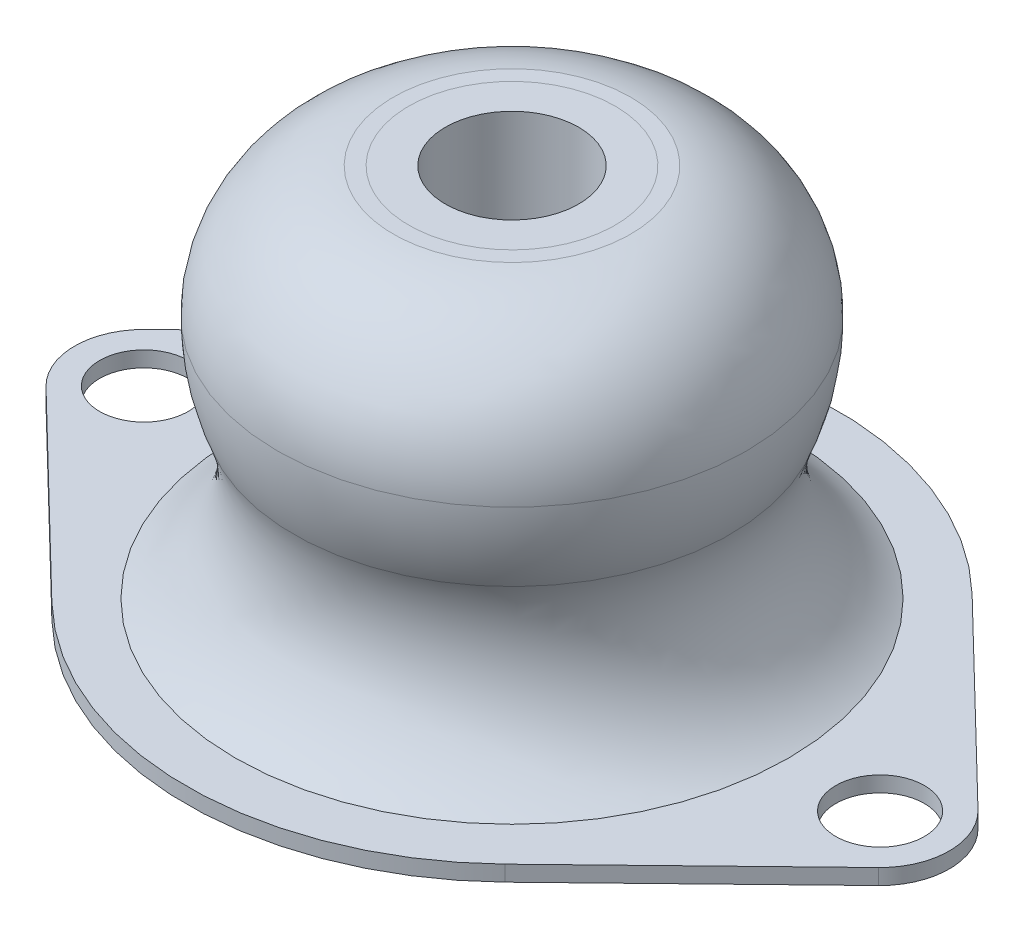
ISO-10303-21;
HEADER;
FILE_DESCRIPTION(('STEP AP214'),'2;1');
FILE_NAME('part.step','',(''),(''),'','','');
FILE_SCHEMA(('AUTOMOTIVE_DESIGN { 1 0 10303 214 1 1 1 1 }'));
ENDSEC;
DATA;
#1=APPLICATION_CONTEXT('core data for automotive mechanical design processes');
#2=APPLICATION_PROTOCOL_DEFINITION('international standard','automotive_design',2000,#1);
#3=PRODUCT_CONTEXT('',#1,'mechanical');
#4=PRODUCT('Part','Part','',(#3));
#5=PRODUCT_RELATED_PRODUCT_CATEGORY('part','',(#4));
#6=PRODUCT_DEFINITION_FORMATION('','',#4);
#7=PRODUCT_DEFINITION_CONTEXT('part definition',#1,'design');
#8=PRODUCT_DEFINITION('design','',#6,#7);
#9=PRODUCT_DEFINITION_SHAPE('','',#8);
#10=(LENGTH_UNIT() NAMED_UNIT(*) SI_UNIT(.MILLI.,.METRE.));
#11=(NAMED_UNIT(*) PLANE_ANGLE_UNIT() SI_UNIT($,.RADIAN.));
#12=(NAMED_UNIT(*) SI_UNIT($,.STERADIAN.) SOLID_ANGLE_UNIT());
#13=UNCERTAINTY_MEASURE_WITH_UNIT(LENGTH_MEASURE(1.E-05),#10,'distance_accuracy_value','');
#14=(GEOMETRIC_REPRESENTATION_CONTEXT(3) GLOBAL_UNCERTAINTY_ASSIGNED_CONTEXT((#13)) GLOBAL_UNIT_ASSIGNED_CONTEXT((#10,
#11,#12)) REPRESENTATION_CONTEXT('',''));
#15=CARTESIAN_POINT('',(0.,0.,0.));
#16=DIRECTION('',(0.,0.,1.));
#17=DIRECTION('',(1.,0.,0.));
#18=AXIS2_PLACEMENT_3D('',#15,#16,#17);
#19=CARTESIAN_POINT('',(-17.9578,-8.763,0.));
#20=DIRECTION('',(0.,-1.,0.));
#21=DIRECTION('',(0.,0.,-1.));
#22=AXIS2_PLACEMENT_3D('',#19,#20,#21);
#23=CYLINDRICAL_SURFACE('',#22,3.3782);
#24=CARTESIAN_POINT('',(-17.9578,-9.525,0.));
#25=DIRECTION('',(0.,-1.,0.));
#26=DIRECTION('',(0.,0.,-1.));
#27=AXIS2_PLACEMENT_3D('',#24,#25,#26);
#28=CIRCLE('',#27,3.3782);
#29=CARTESIAN_POINT('',(-20.3086831683168,-9.525,2.42602216991614));
#30=VERTEX_POINT('',#29);
#31=CARTESIAN_POINT('',(-20.3086831683168,-9.525,-2.42602216991614));
#32=VERTEX_POINT('',#31);
#33=EDGE_CURVE('E149',#30,#32,#28,.T.);
#34=ORIENTED_EDGE('',*,*,#33,.F.);
#35=DIRECTION('',(0.,-1.,0.));
#36=VECTOR('',#35,1.);
#37=CARTESIAN_POINT('',(-20.3086831683168,-8.763,2.42602216991614));
#38=LINE('',#37,#36);
#39=CARTESIAN_POINT('',(-20.3086831683168,-8.763,2.42602216991614));
#40=VERTEX_POINT('',#39);
#41=EDGE_CURVE('E12',#40,#30,#38,.T.);
#42=ORIENTED_EDGE('',*,*,#41,.F.);
#43=CARTESIAN_POINT('',(-17.9578,-8.763,0.));
#44=DIRECTION('',(0.,-1.,0.));
#45=DIRECTION('',(0.,0.,-1.));
#46=AXIS2_PLACEMENT_3D('',#43,#44,#45);
#47=CIRCLE('',#46,3.3782);
#48=CARTESIAN_POINT('',(-20.3086831683168,-8.763,-2.42602216991614));
#49=VERTEX_POINT('',#48);
#50=EDGE_CURVE('E170',#40,#49,#47,.T.);
#51=ORIENTED_EDGE('',*,*,#50,.T.);
#52=DIRECTION('',(0.,-1.,0.));
#53=VECTOR('',#52,1.);
#54=CARTESIAN_POINT('',(-20.3086831683168,-8.763,-2.42602216991614));
#55=LINE('',#54,#53);
#56=EDGE_CURVE('E55',#49,#32,#55,.T.);
#57=ORIENTED_EDGE('',*,*,#56,.T.);
#58=EDGE_LOOP('',(#34,#42,#51,#57));
#59=FACE_BOUND('',#58,.T.);
#60=ADVANCED_FACE('F52',(#59),#23,.T.);
#61=CARTESIAN_POINT('',(-20.3086831683168,-8.763,2.42602216991614));
#62=DIRECTION('',(-0.695898161244696,0.,0.718140480112527));
#63=DIRECTION('',(0.718140480112527,0.,0.695898161244696));
#64=AXIS2_PLACEMENT_3D('',#61,#62,#63);
#65=PLANE('',#64);
#66=DIRECTION('',(-0.718140480112527,0.,-0.695898161244696));
#67=VECTOR('',#66,1.);
#68=CARTESIAN_POINT('',(-20.3086831683168,-9.525,2.42602216991614));
#69=LINE('',#68,#67);
#70=CARTESIAN_POINT('',(-11.0473833097595,-9.525,11.4004801217864));
#71=VERTEX_POINT('',#70);
#72=EDGE_CURVE('E168',#71,#30,#69,.T.);
#73=ORIENTED_EDGE('',*,*,#72,.F.);
#74=DIRECTION('',(0.,-1.,0.));
#75=VECTOR('',#74,1.);
#76=CARTESIAN_POINT('',(-11.0473833097595,-8.763,11.4004801217864));
#77=LINE('',#76,#75);
#78=CARTESIAN_POINT('',(-11.0473833097595,-8.763,11.4004801217864));
#79=VERTEX_POINT('',#78);
#80=EDGE_CURVE('E61',#79,#71,#77,.T.);
#81=ORIENTED_EDGE('',*,*,#80,.F.);
#82=DIRECTION('',(-0.718140480112527,0.,-0.695898161244696));
#83=VECTOR('',#82,1.);
#84=CARTESIAN_POINT('',(-20.3086831683168,-8.763,2.42602216991614));
#85=LINE('',#84,#83);
#86=EDGE_CURVE('E139',#79,#40,#85,.T.);
#87=ORIENTED_EDGE('',*,*,#86,.T.);
#88=ORIENTED_EDGE('',*,*,#41,.T.);
#89=EDGE_LOOP('',(#73,#81,#87,#88));
#90=FACE_BOUND('',#89,.T.);
#91=ADVANCED_FACE('F182',(#90),#65,.T.);
#92=CARTESIAN_POINT('',(0.,-8.763,0.));
#93=DIRECTION('',(0.,-1.,0.));
#94=DIRECTION('',(0.,0.,-1.));
#95=AXIS2_PLACEMENT_3D('',#92,#93,#94);
#96=CYLINDRICAL_SURFACE('',#95,15.875);
#97=CARTESIAN_POINT('',(0.,-9.525,0.));
#98=DIRECTION('',(0.,-1.,0.));
#99=DIRECTION('',(0.,0.,-1.));
#100=AXIS2_PLACEMENT_3D('',#97,#98,#99);
#101=CIRCLE('',#100,15.875);
#102=CARTESIAN_POINT('',(11.0473833097596,-9.525,11.4004801217864));
#103=VERTEX_POINT('',#102);
#104=EDGE_CURVE('E126',#103,#71,#101,.T.);
#105=ORIENTED_EDGE('',*,*,#104,.F.);
#106=DIRECTION('',(0.,-1.,0.));
#107=VECTOR('',#106,1.);
#108=CARTESIAN_POINT('',(11.0473833097596,-8.763,11.4004801217864));
#109=LINE('',#108,#107);
#110=CARTESIAN_POINT('',(11.0473833097596,-8.763,11.4004801217864));
#111=VERTEX_POINT('',#110);
#112=EDGE_CURVE('E121',#111,#103,#109,.T.);
#113=ORIENTED_EDGE('',*,*,#112,.F.);
#114=CARTESIAN_POINT('',(0.,-8.763,0.));
#115=DIRECTION('',(0.,-1.,0.));
#116=DIRECTION('',(0.,0.,-1.));
#117=AXIS2_PLACEMENT_3D('',#114,#115,#116);
#118=CIRCLE('',#117,15.875);
#119=EDGE_CURVE('E124',#111,#79,#118,.T.);
#120=ORIENTED_EDGE('',*,*,#119,.T.);
#121=ORIENTED_EDGE('',*,*,#80,.T.);
#122=EDGE_LOOP('',(#105,#113,#120,#121));
#123=FACE_BOUND('',#122,.T.);
#124=ADVANCED_FACE('F123',(#123),#96,.T.);
#125=CARTESIAN_POINT('',(20.3086831683168,-8.763,2.42602216991614));
#126=DIRECTION('',(0.695898161244696,0.,0.718140480112527));
#127=DIRECTION('',(0.718140480112527,0.,-0.695898161244696));
#128=AXIS2_PLACEMENT_3D('',#125,#126,#127);
#129=PLANE('',#128);
#130=DIRECTION('',(-0.718140480112527,0.,0.695898161244696));
#131=VECTOR('',#130,1.);
#132=CARTESIAN_POINT('',(20.3086831683168,-9.525,2.42602216991614));
#133=LINE('',#132,#131);
#134=CARTESIAN_POINT('',(20.3086831683168,-9.525,2.42602216991614));
#135=VERTEX_POINT('',#134);
#136=EDGE_CURVE('E165',#135,#103,#133,.T.);
#137=ORIENTED_EDGE('',*,*,#136,.F.);
#138=DIRECTION('',(0.,-1.,0.));
#139=VECTOR('',#138,1.);
#140=CARTESIAN_POINT('',(20.3086831683168,-8.763,2.42602216991614));
#141=LINE('',#140,#139);
#142=CARTESIAN_POINT('',(20.3086831683168,-8.763,2.42602216991614));
#143=VERTEX_POINT('',#142);
#144=EDGE_CURVE('E131',#143,#135,#141,.T.);
#145=ORIENTED_EDGE('',*,*,#144,.F.);
#146=DIRECTION('',(-0.718140480112527,0.,0.695898161244696));
#147=VECTOR('',#146,1.);
#148=CARTESIAN_POINT('',(20.3086831683168,-8.763,2.42602216991614));
#149=LINE('',#148,#147);
#150=EDGE_CURVE('E137',#143,#111,#149,.T.);
#151=ORIENTED_EDGE('',*,*,#150,.T.);
#152=ORIENTED_EDGE('',*,*,#112,.T.);
#153=EDGE_LOOP('',(#137,#145,#151,#152));
#154=FACE_BOUND('',#153,.T.);
#155=ADVANCED_FACE('F141',(#154),#129,.T.);
#156=CARTESIAN_POINT('',(17.9578,-8.763,0.));
#157=DIRECTION('',(0.,-1.,0.));
#158=DIRECTION('',(0.,0.,-1.));
#159=AXIS2_PLACEMENT_3D('',#156,#157,#158);
#160=CYLINDRICAL_SURFACE('',#159,3.3782);
#161=CARTESIAN_POINT('',(17.9578,-9.525,0.));
#162=DIRECTION('',(0.,-1.,0.));
#163=DIRECTION('',(0.,0.,-1.));
#164=AXIS2_PLACEMENT_3D('',#161,#162,#163);
#165=CIRCLE('',#164,3.3782);
#166=CARTESIAN_POINT('',(20.3086831683168,-9.525,-2.42602216991614));
#167=VERTEX_POINT('',#166);
#168=EDGE_CURVE('E162',#167,#135,#165,.T.);
#169=ORIENTED_EDGE('',*,*,#168,.F.);
#170=DIRECTION('',(0.,-1.,0.));
#171=VECTOR('',#170,1.);
#172=CARTESIAN_POINT('',(20.3086831683168,-8.763,-2.42602216991614));
#173=LINE('',#172,#171);
#174=CARTESIAN_POINT('',(20.3086831683168,-8.763,-2.42602216991614));
#175=VERTEX_POINT('',#174);
#176=EDGE_CURVE('E174',#175,#167,#173,.T.);
#177=ORIENTED_EDGE('',*,*,#176,.F.);
#178=CARTESIAN_POINT('',(17.9578,-8.763,0.));
#179=DIRECTION('',(0.,-1.,0.));
#180=DIRECTION('',(0.,0.,-1.));
#181=AXIS2_PLACEMENT_3D('',#178,#179,#180);
#182=CIRCLE('',#181,3.3782);
#183=EDGE_CURVE('E142',#175,#143,#182,.T.);
#184=ORIENTED_EDGE('',*,*,#183,.T.);
#185=ORIENTED_EDGE('',*,*,#144,.T.);
#186=EDGE_LOOP('',(#169,#177,#184,#185));
#187=FACE_BOUND('',#186,.T.);
#188=ADVANCED_FACE('F195',(#187),#160,.T.);
#189=CARTESIAN_POINT('',(20.3086831683168,-8.763,-2.42602216991614));
#190=DIRECTION('',(0.695898161244697,0.,-0.718140480112527));
#191=DIRECTION('',(-0.718140480112527,0.,-0.695898161244697));
#192=AXIS2_PLACEMENT_3D('',#189,#190,#191);
#193=PLANE('',#192);
#194=DIRECTION('',(0.718140480112527,0.,0.695898161244697));
#195=VECTOR('',#194,1.);
#196=CARTESIAN_POINT('',(20.3086831683168,-9.525,-2.42602216991614));
#197=LINE('',#196,#195);
#198=CARTESIAN_POINT('',(11.0473833097596,-9.525,-11.4004801217864));
#199=VERTEX_POINT('',#198);
#200=EDGE_CURVE('E159',#199,#167,#197,.T.);
#201=ORIENTED_EDGE('',*,*,#200,.F.);
#202=DIRECTION('',(0.,-1.,0.));
#203=VECTOR('',#202,1.);
#204=CARTESIAN_POINT('',(11.0473833097596,-8.763,-11.4004801217864));
#205=LINE('',#204,#203);
#206=CARTESIAN_POINT('',(11.0473833097596,-8.763,-11.4004801217864));
#207=VERTEX_POINT('',#206);
#208=EDGE_CURVE('E176',#207,#199,#205,.T.);
#209=ORIENTED_EDGE('',*,*,#208,.F.);
#210=DIRECTION('',(0.718140480112527,0.,0.695898161244697));
#211=VECTOR('',#210,1.);
#212=CARTESIAN_POINT('',(20.3086831683168,-8.763,-2.42602216991614));
#213=LINE('',#212,#211);
#214=EDGE_CURVE('E144',#207,#175,#213,.T.);
#215=ORIENTED_EDGE('',*,*,#214,.T.);
#216=ORIENTED_EDGE('',*,*,#176,.T.);
#217=EDGE_LOOP('',(#201,#209,#215,#216));
#218=FACE_BOUND('',#217,.T.);
#219=ADVANCED_FACE('F198',(#218),#193,.T.);
#220=CARTESIAN_POINT('',(0.,-8.763,0.));
#221=DIRECTION('',(0.,-1.,0.));
#222=DIRECTION('',(0.,0.,-1.));
#223=AXIS2_PLACEMENT_3D('',#220,#221,#222);
#224=CYLINDRICAL_SURFACE('',#223,15.875);
#225=CARTESIAN_POINT('',(0.,-9.525,0.));
#226=DIRECTION('',(0.,-1.,0.));
#227=DIRECTION('',(0.,0.,-1.));
#228=AXIS2_PLACEMENT_3D('',#225,#226,#227);
#229=CIRCLE('',#228,15.875);
#230=CARTESIAN_POINT('',(-11.0473833097595,-9.525,-11.4004801217864));
#231=VERTEX_POINT('',#230);
#232=EDGE_CURVE('E156',#231,#199,#229,.T.);
#233=ORIENTED_EDGE('',*,*,#232,.F.);
#234=DIRECTION('',(0.,-1.,0.));
#235=VECTOR('',#234,1.);
#236=CARTESIAN_POINT('',(-11.0473833097595,-8.763,-11.4004801217864));
#237=LINE('',#236,#235);
#238=CARTESIAN_POINT('',(-11.0473833097595,-8.763,-11.4004801217864));
#239=VERTEX_POINT('',#238);
#240=EDGE_CURVE('E177',#239,#231,#237,.T.);
#241=ORIENTED_EDGE('',*,*,#240,.F.);
#242=CARTESIAN_POINT('',(0.,-8.763,0.));
#243=DIRECTION('',(0.,-1.,0.));
#244=DIRECTION('',(0.,0.,-1.));
#245=AXIS2_PLACEMENT_3D('',#242,#243,#244);
#246=CIRCLE('',#245,15.875);
#247=EDGE_CURVE('E254',#239,#207,#246,.T.);
#248=ORIENTED_EDGE('',*,*,#247,.T.);
#249=ORIENTED_EDGE('',*,*,#208,.T.);
#250=EDGE_LOOP('',(#233,#241,#248,#249));
#251=FACE_BOUND('',#250,.T.);
#252=ADVANCED_FACE('F202',(#251),#224,.T.);
#253=CARTESIAN_POINT('',(-20.3086831683168,-8.763,-2.42602216991614));
#254=DIRECTION('',(-0.695898161244696,0.,-0.718140480112527));
#255=DIRECTION('',(-0.718140480112527,0.,0.695898161244696));
#256=AXIS2_PLACEMENT_3D('',#253,#254,#255);
#257=PLANE('',#256);
#258=DIRECTION('',(0.718140480112527,0.,-0.695898161244696));
#259=VECTOR('',#258,1.);
#260=CARTESIAN_POINT('',(-20.3086831683168,-9.525,-2.42602216991614));
#261=LINE('',#260,#259);
#262=EDGE_CURVE('E152',#32,#231,#261,.T.);
#263=ORIENTED_EDGE('',*,*,#262,.F.);
#264=ORIENTED_EDGE('',*,*,#56,.F.);
#265=DIRECTION('',(0.718140480112527,0.,-0.695898161244696));
#266=VECTOR('',#265,1.);
#267=CARTESIAN_POINT('',(-20.3086831683168,-8.763,-2.42602216991614));
#268=LINE('',#267,#266);
#269=EDGE_CURVE('E252',#49,#239,#268,.T.);
#270=ORIENTED_EDGE('',*,*,#269,.T.);
#271=ORIENTED_EDGE('',*,*,#240,.T.);
#272=EDGE_LOOP('',(#263,#264,#270,#271));
#273=FACE_BOUND('',#272,.T.);
#274=ADVANCED_FACE('F179',(#273),#257,.T.);
#275=CARTESIAN_POINT('',(-17.9578,-8.763,0.));
#276=DIRECTION('',(0.,-1.,0.));
#277=DIRECTION('',(0.,0.,-1.));
#278=AXIS2_PLACEMENT_3D('',#275,#276,#277);
#279=PLANE('',#278);
#280=CARTESIAN_POINT('',(0.,-8.763,0.));
#281=DIRECTION('',(0.,-1.,0.));
#282=DIRECTION('',(0.,0.,-1.));
#283=AXIS2_PLACEMENT_3D('',#280,#281,#282);
#284=CIRCLE('',#283,9.525);
#285=CARTESIAN_POINT('',(0.,-8.763,-9.525));
#286=VERTEX_POINT('',#285);
#287=EDGE_CURVE('E233',#286,#286,#284,.T.);
#288=ORIENTED_EDGE('',*,*,#287,.T.);
#289=EDGE_LOOP('',(#288));
#290=FACE_BOUND('',#289,.T.);
#291=CARTESIAN_POINT('',(17.9578,-8.763,0.));
#292=DIRECTION('',(0.,-1.,0.));
#293=DIRECTION('',(0.,0.,-1.));
#294=AXIS2_PLACEMENT_3D('',#291,#292,#293);
#295=CIRCLE('',#294,2.159);
#296=CARTESIAN_POINT('',(17.9578,-8.763,-2.159));
#297=VERTEX_POINT('',#296);
#298=EDGE_CURVE('E241',#297,#297,#295,.T.);
#299=ORIENTED_EDGE('',*,*,#298,.T.);
#300=EDGE_LOOP('',(#299));
#301=FACE_BOUND('',#300,.T.);
#302=CARTESIAN_POINT('',(-17.9578,-8.763,0.));
#303=DIRECTION('',(0.,-1.,0.));
#304=DIRECTION('',(0.,0.,-1.));
#305=AXIS2_PLACEMENT_3D('',#302,#303,#304);
#306=CIRCLE('',#305,2.159);
#307=CARTESIAN_POINT('',(-17.9578,-8.763,-2.159));
#308=VERTEX_POINT('',#307);
#309=EDGE_CURVE('E153',#308,#308,#306,.T.);
#310=ORIENTED_EDGE('',*,*,#309,.T.);
#311=EDGE_LOOP('',(#310));
#312=FACE_BOUND('',#311,.T.);
#313=ORIENTED_EDGE('',*,*,#50,.F.);
#314=ORIENTED_EDGE('',*,*,#86,.F.);
#315=ORIENTED_EDGE('',*,*,#119,.F.);
#316=ORIENTED_EDGE('',*,*,#150,.F.);
#317=ORIENTED_EDGE('',*,*,#183,.F.);
#318=ORIENTED_EDGE('',*,*,#214,.F.);
#319=ORIENTED_EDGE('',*,*,#247,.F.);
#320=ORIENTED_EDGE('',*,*,#269,.F.);
#321=EDGE_LOOP('',(#313,#314,#315,#316,#317,#318,#319,#320));
#322=FACE_BOUND('',#321,.T.);
#323=ADVANCED_FACE('F135',(#290,#301,#312,#322),#279,.F.);
#324=CARTESIAN_POINT('',(-17.9578,-9.525,0.));
#325=DIRECTION('',(0.,-1.,0.));
#326=DIRECTION('',(0.,0.,-1.));
#327=AXIS2_PLACEMENT_3D('',#324,#325,#326);
#328=PLANE('',#327);
#329=CARTESIAN_POINT('',(0.,-9.525,0.));
#330=DIRECTION('',(0.,-1.,0.));
#331=DIRECTION('',(0.,0.,-1.));
#332=AXIS2_PLACEMENT_3D('',#329,#330,#331);
#333=CIRCLE('',#332,9.525);
#334=CARTESIAN_POINT('',(0.,-9.525,-9.525));
#335=VERTEX_POINT('',#334);
#336=EDGE_CURVE('E236',#335,#335,#333,.T.);
#337=ORIENTED_EDGE('',*,*,#336,.F.);
#338=EDGE_LOOP('',(#337));
#339=FACE_BOUND('',#338,.T.);
#340=CARTESIAN_POINT('',(17.9578,-9.525,0.));
#341=DIRECTION('',(0.,-1.,0.));
#342=DIRECTION('',(0.,0.,-1.));
#343=AXIS2_PLACEMENT_3D('',#340,#341,#342);
#344=CIRCLE('',#343,2.159);
#345=CARTESIAN_POINT('',(17.9578,-9.525,-2.159));
#346=VERTEX_POINT('',#345);
#347=EDGE_CURVE('E238',#346,#346,#344,.T.);
#348=ORIENTED_EDGE('',*,*,#347,.F.);
#349=EDGE_LOOP('',(#348));
#350=FACE_BOUND('',#349,.T.);
#351=CARTESIAN_POINT('',(-17.9578,-9.525,0.));
#352=DIRECTION('',(0.,-1.,0.));
#353=DIRECTION('',(0.,0.,-1.));
#354=AXIS2_PLACEMENT_3D('',#351,#352,#353);
#355=CIRCLE('',#354,2.159);
#356=CARTESIAN_POINT('',(-17.9578,-9.525,-2.159));
#357=VERTEX_POINT('',#356);
#358=EDGE_CURVE('E244',#357,#357,#355,.T.);
#359=ORIENTED_EDGE('',*,*,#358,.F.);
#360=EDGE_LOOP('',(#359));
#361=FACE_BOUND('',#360,.T.);
#362=ORIENTED_EDGE('',*,*,#33,.T.);
#363=ORIENTED_EDGE('',*,*,#262,.T.);
#364=ORIENTED_EDGE('',*,*,#232,.T.);
#365=ORIENTED_EDGE('',*,*,#200,.T.);
#366=ORIENTED_EDGE('',*,*,#168,.T.);
#367=ORIENTED_EDGE('',*,*,#136,.T.);
#368=ORIENTED_EDGE('',*,*,#104,.T.);
#369=ORIENTED_EDGE('',*,*,#72,.T.);
#370=EDGE_LOOP('',(#362,#363,#364,#365,#366,#367,#368,#369));
#371=FACE_BOUND('',#370,.T.);
#372=ADVANCED_FACE('F181',(#339,#350,#361,#371),#328,.T.);
#373=CARTESIAN_POINT('',(-17.9578,-8.763,0.));
#374=DIRECTION('',(0.,-1.,0.));
#375=DIRECTION('',(0.,0.,-1.));
#376=AXIS2_PLACEMENT_3D('',#373,#374,#375);
#377=CYLINDRICAL_SURFACE('',#376,2.159);
#378=CARTESIAN_POINT('',(-17.9578,-8.763,-2.159));
#379=CARTESIAN_POINT('',(-17.9578,-8.7709375,-2.159));
#380=CARTESIAN_POINT('',(-17.9578,-8.778875,-2.159));
#381=CARTESIAN_POINT('',(-17.9578,-8.79475,-2.159));
#382=CARTESIAN_POINT('',(-17.9578,-8.8026875,-2.159));
#383=CARTESIAN_POINT('',(-17.9578,-8.8185625,-2.159));
#384=CARTESIAN_POINT('',(-17.9578,-8.8265,-2.159));
#385=CARTESIAN_POINT('',(-17.9578,-8.842375,-2.159));
#386=CARTESIAN_POINT('',(-17.9578,-8.8503125,-2.159));
#387=CARTESIAN_POINT('',(-17.9578,-8.8661875,-2.159));
#388=CARTESIAN_POINT('',(-17.9578,-8.874125,-2.159));
#389=CARTESIAN_POINT('',(-17.9578,-8.89,-2.159));
#390=CARTESIAN_POINT('',(-17.9578,-8.8979375,-2.159));
#391=CARTESIAN_POINT('',(-17.9578,-8.9138125,-2.159));
#392=CARTESIAN_POINT('',(-17.9578,-8.92175,-2.159));
#393=CARTESIAN_POINT('',(-17.9578,-8.937625,-2.159));
#394=CARTESIAN_POINT('',(-17.9578,-8.9455625,-2.159));
#395=CARTESIAN_POINT('',(-17.9578,-8.9614375,-2.159));
#396=CARTESIAN_POINT('',(-17.9578,-8.969375,-2.159));
#397=CARTESIAN_POINT('',(-17.9578,-8.98525,-2.159));
#398=CARTESIAN_POINT('',(-17.9578,-8.9931875,-2.159));
#399=CARTESIAN_POINT('',(-17.9578,-9.0090625,-2.159));
#400=CARTESIAN_POINT('',(-17.9578,-9.017,-2.159));
#401=CARTESIAN_POINT('',(-17.9578,-9.032875,-2.159));
#402=CARTESIAN_POINT('',(-17.9578,-9.0408125,-2.159));
#403=CARTESIAN_POINT('',(-17.9578,-9.0566875,-2.159));
#404=CARTESIAN_POINT('',(-17.9578,-9.064625,-2.159));
#405=CARTESIAN_POINT('',(-17.9578,-9.0805,-2.159));
#406=CARTESIAN_POINT('',(-17.9578,-9.0884375,-2.159));
#407=CARTESIAN_POINT('',(-17.9578,-9.1043125,-2.159));
#408=CARTESIAN_POINT('',(-17.9578,-9.11225,-2.159));
#409=CARTESIAN_POINT('',(-17.9578,-9.128125,-2.159));
#410=CARTESIAN_POINT('',(-17.9578,-9.1360625,-2.159));
#411=CARTESIAN_POINT('',(-17.9578,-9.1519375,-2.159));
#412=CARTESIAN_POINT('',(-17.9578,-9.159875,-2.159));
#413=CARTESIAN_POINT('',(-17.9578,-9.17575,-2.159));
#414=CARTESIAN_POINT('',(-17.9578,-9.1836875,-2.159));
#415=CARTESIAN_POINT('',(-17.9578,-9.1995625,-2.159));
#416=CARTESIAN_POINT('',(-17.9578,-9.2075,-2.159));
#417=CARTESIAN_POINT('',(-17.9578,-9.223375,-2.159));
#418=CARTESIAN_POINT('',(-17.9578,-9.2313125,-2.159));
#419=CARTESIAN_POINT('',(-17.9578,-9.2471875,-2.159));
#420=CARTESIAN_POINT('',(-17.9578,-9.255125,-2.159));
#421=CARTESIAN_POINT('',(-17.9578,-9.271,-2.159));
#422=CARTESIAN_POINT('',(-17.9578,-9.2789375,-2.159));
#423=CARTESIAN_POINT('',(-17.9578,-9.2948125,-2.159));
#424=CARTESIAN_POINT('',(-17.9578,-9.30275,-2.159));
#425=CARTESIAN_POINT('',(-17.9578,-9.318625,-2.159));
#426=CARTESIAN_POINT('',(-17.9578,-9.3265625,-2.159));
#427=CARTESIAN_POINT('',(-17.9578,-9.3424375,-2.159));
#428=CARTESIAN_POINT('',(-17.9578,-9.350375,-2.159));
#429=CARTESIAN_POINT('',(-17.9578,-9.36625,-2.159));
#430=CARTESIAN_POINT('',(-17.9578,-9.3741875,-2.159));
#431=CARTESIAN_POINT('',(-17.9578,-9.3900625,-2.159));
#432=CARTESIAN_POINT('',(-17.9578,-9.398,-2.159));
#433=CARTESIAN_POINT('',(-17.9578,-9.413875,-2.159));
#434=CARTESIAN_POINT('',(-17.9578,-9.4218125,-2.159));
#435=CARTESIAN_POINT('',(-17.9578,-9.4376875,-2.159));
#436=CARTESIAN_POINT('',(-17.9578,-9.445625,-2.159));
#437=CARTESIAN_POINT('',(-17.9578,-9.4615,-2.159));
#438=CARTESIAN_POINT('',(-17.9578,-9.4694375,-2.159));
#439=CARTESIAN_POINT('',(-17.9578,-9.4853125,-2.159));
#440=CARTESIAN_POINT('',(-17.9578,-9.49325,-2.159));
#441=CARTESIAN_POINT('',(-17.9578,-9.509125,-2.159));
#442=CARTESIAN_POINT('',(-17.9578,-9.5170625,-2.159));
#443=CARTESIAN_POINT('',(-17.9578,-9.525,-2.159));
#444=B_SPLINE_CURVE_WITH_KNOTS('',3,(#378,#379,#380,#381,#382,#383,#384,#385,#386,#387,#388,
#389,#390,#391,#392,#393,#394,#395,#396,#397,#398,#399,#400,#401,#402,#403,#404,#405,#406,#407,
#408,#409,#410,#411,#412,#413,#414,#415,#416,#417,#418,#419,#420,#421,#422,#423,#424,#425,#426,
#427,#428,#429,#430,#431,#432,#433,#434,#435,#436,#437,#438,#439,#440,#441,#442,#443),
.UNSPECIFIED.,.F.,.F.,(4,2,2,2,2,2,2,2,2,2,2,2,2,2,2,2,2,2,2,2,2,2,2,2,2,2,2,2,2,2,2,2,4),(0.,
0.0238125000000013,0.0476250000000008,0.0714375000000003,0.0952500000000016,0.119062500000001,
0.142875000000001,0.1666875,0.190500000000001,0.214312500000001,0.238125,0.261937500000002,
0.285750000000001,0.309562500000001,0.333375,0.357187500000002,0.381000000000001,
0.404812500000001,0.428625000000002,0.452437500000001,0.476250000000001,0.500062500000001,
0.523875000000002,0.547687500000001,0.571500000000001,0.595312500000002,0.619125000000002,
0.642937500000001,0.666750000000001,0.690562500000002,0.714375000000001,0.738187500000001,
0.762000000000002),.UNSPECIFIED.);
#445=EDGE_CURVE('BSEAM214',#308,#357,#444,.T.);
#446=ORIENTED_EDGE('',*,*,#309,.F.);
#447=ORIENTED_EDGE('',*,*,#358,.T.);
#448=ORIENTED_EDGE('',*,*,#445,.T.);
#449=ORIENTED_EDGE('',*,*,#445,.F.);
#450=EDGE_LOOP('',(#446,#448,#447,#449));
#451=FACE_BOUND('',#450,.T.);
#452=ADVANCED_FACE('F214',(#451),#377,.F.);
#453=CARTESIAN_POINT('',(17.9578,-8.763,0.));
#454=DIRECTION('',(0.,-1.,0.));
#455=DIRECTION('',(0.,0.,-1.));
#456=AXIS2_PLACEMENT_3D('',#453,#454,#455);
#457=CYLINDRICAL_SURFACE('',#456,2.159);
#458=CARTESIAN_POINT('',(17.9578,-8.763,-2.159));
#459=CARTESIAN_POINT('',(17.9578,-8.7709375,-2.159));
#460=CARTESIAN_POINT('',(17.9578,-8.778875,-2.159));
#461=CARTESIAN_POINT('',(17.9578,-8.79475,-2.159));
#462=CARTESIAN_POINT('',(17.9578,-8.8026875,-2.159));
#463=CARTESIAN_POINT('',(17.9578,-8.8185625,-2.159));
#464=CARTESIAN_POINT('',(17.9578,-8.8265,-2.159));
#465=CARTESIAN_POINT('',(17.9578,-8.842375,-2.159));
#466=CARTESIAN_POINT('',(17.9578,-8.8503125,-2.159));
#467=CARTESIAN_POINT('',(17.9578,-8.8661875,-2.159));
#468=CARTESIAN_POINT('',(17.9578,-8.874125,-2.159));
#469=CARTESIAN_POINT('',(17.9578,-8.89,-2.159));
#470=CARTESIAN_POINT('',(17.9578,-8.8979375,-2.159));
#471=CARTESIAN_POINT('',(17.9578,-8.9138125,-2.159));
#472=CARTESIAN_POINT('',(17.9578,-8.92175,-2.159));
#473=CARTESIAN_POINT('',(17.9578,-8.937625,-2.159));
#474=CARTESIAN_POINT('',(17.9578,-8.9455625,-2.159));
#475=CARTESIAN_POINT('',(17.9578,-8.9614375,-2.159));
#476=CARTESIAN_POINT('',(17.9578,-8.969375,-2.159));
#477=CARTESIAN_POINT('',(17.9578,-8.98525,-2.159));
#478=CARTESIAN_POINT('',(17.9578,-8.9931875,-2.159));
#479=CARTESIAN_POINT('',(17.9578,-9.0090625,-2.159));
#480=CARTESIAN_POINT('',(17.9578,-9.017,-2.159));
#481=CARTESIAN_POINT('',(17.9578,-9.032875,-2.159));
#482=CARTESIAN_POINT('',(17.9578,-9.0408125,-2.159));
#483=CARTESIAN_POINT('',(17.9578,-9.0566875,-2.159));
#484=CARTESIAN_POINT('',(17.9578,-9.064625,-2.159));
#485=CARTESIAN_POINT('',(17.9578,-9.0805,-2.159));
#486=CARTESIAN_POINT('',(17.9578,-9.0884375,-2.159));
#487=CARTESIAN_POINT('',(17.9578,-9.1043125,-2.159));
#488=CARTESIAN_POINT('',(17.9578,-9.11225,-2.159));
#489=CARTESIAN_POINT('',(17.9578,-9.128125,-2.159));
#490=CARTESIAN_POINT('',(17.9578,-9.1360625,-2.159));
#491=CARTESIAN_POINT('',(17.9578,-9.1519375,-2.159));
#492=CARTESIAN_POINT('',(17.9578,-9.159875,-2.159));
#493=CARTESIAN_POINT('',(17.9578,-9.17575,-2.159));
#494=CARTESIAN_POINT('',(17.9578,-9.1836875,-2.159));
#495=CARTESIAN_POINT('',(17.9578,-9.1995625,-2.159));
#496=CARTESIAN_POINT('',(17.9578,-9.2075,-2.159));
#497=CARTESIAN_POINT('',(17.9578,-9.223375,-2.159));
#498=CARTESIAN_POINT('',(17.9578,-9.2313125,-2.159));
#499=CARTESIAN_POINT('',(17.9578,-9.2471875,-2.159));
#500=CARTESIAN_POINT('',(17.9578,-9.255125,-2.159));
#501=CARTESIAN_POINT('',(17.9578,-9.271,-2.159));
#502=CARTESIAN_POINT('',(17.9578,-9.2789375,-2.159));
#503=CARTESIAN_POINT('',(17.9578,-9.2948125,-2.159));
#504=CARTESIAN_POINT('',(17.9578,-9.30275,-2.159));
#505=CARTESIAN_POINT('',(17.9578,-9.318625,-2.159));
#506=CARTESIAN_POINT('',(17.9578,-9.3265625,-2.159));
#507=CARTESIAN_POINT('',(17.9578,-9.3424375,-2.159));
#508=CARTESIAN_POINT('',(17.9578,-9.350375,-2.159));
#509=CARTESIAN_POINT('',(17.9578,-9.36625,-2.159));
#510=CARTESIAN_POINT('',(17.9578,-9.3741875,-2.159));
#511=CARTESIAN_POINT('',(17.9578,-9.3900625,-2.159));
#512=CARTESIAN_POINT('',(17.9578,-9.398,-2.159));
#513=CARTESIAN_POINT('',(17.9578,-9.413875,-2.159));
#514=CARTESIAN_POINT('',(17.9578,-9.4218125,-2.159));
#515=CARTESIAN_POINT('',(17.9578,-9.4376875,-2.159));
#516=CARTESIAN_POINT('',(17.9578,-9.445625,-2.159));
#517=CARTESIAN_POINT('',(17.9578,-9.4615,-2.159));
#518=CARTESIAN_POINT('',(17.9578,-9.4694375,-2.159));
#519=CARTESIAN_POINT('',(17.9578,-9.4853125,-2.159));
#520=CARTESIAN_POINT('',(17.9578,-9.49325,-2.159));
#521=CARTESIAN_POINT('',(17.9578,-9.509125,-2.159));
#522=CARTESIAN_POINT('',(17.9578,-9.5170625,-2.159));
#523=CARTESIAN_POINT('',(17.9578,-9.525,-2.159));
#524=B_SPLINE_CURVE_WITH_KNOTS('',3,(#458,#459,#460,#461,#462,#463,#464,#465,#466,#467,#468,
#469,#470,#471,#472,#473,#474,#475,#476,#477,#478,#479,#480,#481,#482,#483,#484,#485,#486,#487,
#488,#489,#490,#491,#492,#493,#494,#495,#496,#497,#498,#499,#500,#501,#502,#503,#504,#505,#506,
#507,#508,#509,#510,#511,#512,#513,#514,#515,#516,#517,#518,#519,#520,#521,#522,#523),
.UNSPECIFIED.,.F.,.F.,(4,2,2,2,2,2,2,2,2,2,2,2,2,2,2,2,2,2,2,2,2,2,2,2,2,2,2,2,2,2,2,2,4),(0.,
0.0238125000000013,0.0476250000000008,0.0714375000000003,0.0952500000000016,0.119062500000001,
0.142875000000001,0.1666875,0.190500000000001,0.214312500000001,0.238125,0.261937500000002,
0.285750000000001,0.309562500000001,0.333375,0.357187500000002,0.381000000000001,
0.404812500000001,0.428625000000002,0.452437500000001,0.476250000000001,0.500062500000001,
0.523875000000002,0.547687500000001,0.571500000000001,0.595312500000002,0.619125000000002,
0.642937500000001,0.666750000000001,0.690562500000002,0.714375000000001,0.738187500000001,
0.762000000000002),.UNSPECIFIED.);
#525=EDGE_CURVE('BSEAM221',#297,#346,#524,.T.);
#526=ORIENTED_EDGE('',*,*,#298,.F.);
#527=ORIENTED_EDGE('',*,*,#347,.T.);
#528=ORIENTED_EDGE('',*,*,#525,.T.);
#529=ORIENTED_EDGE('',*,*,#525,.F.);
#530=EDGE_LOOP('',(#526,#528,#527,#529));
#531=FACE_BOUND('',#530,.T.);
#532=ADVANCED_FACE('F221',(#531),#457,.F.);
#533=CARTESIAN_POINT('',(0.,-8.763,0.));
#534=DIRECTION('',(0.,-1.,0.));
#535=DIRECTION('',(0.,0.,-1.));
#536=AXIS2_PLACEMENT_3D('',#533,#534,#535);
#537=CYLINDRICAL_SURFACE('',#536,9.525);
#538=CARTESIAN_POINT('',(0.,-8.763,-9.525));
#539=CARTESIAN_POINT('',(0.,-8.7709375,-9.525));
#540=CARTESIAN_POINT('',(0.,-8.778875,-9.525));
#541=CARTESIAN_POINT('',(0.,-8.79475,-9.525));
#542=CARTESIAN_POINT('',(0.,-8.8026875,-9.525));
#543=CARTESIAN_POINT('',(0.,-8.8185625,-9.525));
#544=CARTESIAN_POINT('',(0.,-8.8265,-9.525));
#545=CARTESIAN_POINT('',(0.,-8.842375,-9.525));
#546=CARTESIAN_POINT('',(0.,-8.8503125,-9.525));
#547=CARTESIAN_POINT('',(0.,-8.8661875,-9.525));
#548=CARTESIAN_POINT('',(0.,-8.874125,-9.525));
#549=CARTESIAN_POINT('',(0.,-8.89,-9.525));
#550=CARTESIAN_POINT('',(0.,-8.8979375,-9.525));
#551=CARTESIAN_POINT('',(0.,-8.9138125,-9.525));
#552=CARTESIAN_POINT('',(0.,-8.92175,-9.525));
#553=CARTESIAN_POINT('',(0.,-8.937625,-9.525));
#554=CARTESIAN_POINT('',(0.,-8.9455625,-9.525));
#555=CARTESIAN_POINT('',(0.,-8.9614375,-9.525));
#556=CARTESIAN_POINT('',(0.,-8.969375,-9.525));
#557=CARTESIAN_POINT('',(0.,-8.98525,-9.525));
#558=CARTESIAN_POINT('',(0.,-8.9931875,-9.525));
#559=CARTESIAN_POINT('',(0.,-9.0090625,-9.525));
#560=CARTESIAN_POINT('',(0.,-9.017,-9.525));
#561=CARTESIAN_POINT('',(0.,-9.032875,-9.525));
#562=CARTESIAN_POINT('',(0.,-9.0408125,-9.525));
#563=CARTESIAN_POINT('',(0.,-9.0566875,-9.525));
#564=CARTESIAN_POINT('',(0.,-9.064625,-9.525));
#565=CARTESIAN_POINT('',(0.,-9.0805,-9.525));
#566=CARTESIAN_POINT('',(0.,-9.0884375,-9.525));
#567=CARTESIAN_POINT('',(0.,-9.1043125,-9.525));
#568=CARTESIAN_POINT('',(0.,-9.11225,-9.525));
#569=CARTESIAN_POINT('',(0.,-9.128125,-9.525));
#570=CARTESIAN_POINT('',(0.,-9.1360625,-9.525));
#571=CARTESIAN_POINT('',(0.,-9.1519375,-9.525));
#572=CARTESIAN_POINT('',(0.,-9.159875,-9.525));
#573=CARTESIAN_POINT('',(0.,-9.17575,-9.525));
#574=CARTESIAN_POINT('',(0.,-9.1836875,-9.525));
#575=CARTESIAN_POINT('',(0.,-9.1995625,-9.525));
#576=CARTESIAN_POINT('',(0.,-9.2075,-9.525));
#577=CARTESIAN_POINT('',(0.,-9.223375,-9.525));
#578=CARTESIAN_POINT('',(0.,-9.2313125,-9.525));
#579=CARTESIAN_POINT('',(0.,-9.2471875,-9.525));
#580=CARTESIAN_POINT('',(0.,-9.255125,-9.525));
#581=CARTESIAN_POINT('',(0.,-9.271,-9.525));
#582=CARTESIAN_POINT('',(0.,-9.2789375,-9.525));
#583=CARTESIAN_POINT('',(0.,-9.2948125,-9.525));
#584=CARTESIAN_POINT('',(0.,-9.30275,-9.525));
#585=CARTESIAN_POINT('',(0.,-9.318625,-9.525));
#586=CARTESIAN_POINT('',(0.,-9.3265625,-9.525));
#587=CARTESIAN_POINT('',(0.,-9.3424375,-9.525));
#588=CARTESIAN_POINT('',(0.,-9.350375,-9.525));
#589=CARTESIAN_POINT('',(0.,-9.36625,-9.525));
#590=CARTESIAN_POINT('',(0.,-9.3741875,-9.525));
#591=CARTESIAN_POINT('',(0.,-9.3900625,-9.525));
#592=CARTESIAN_POINT('',(0.,-9.398,-9.525));
#593=CARTESIAN_POINT('',(0.,-9.413875,-9.525));
#594=CARTESIAN_POINT('',(0.,-9.4218125,-9.525));
#595=CARTESIAN_POINT('',(0.,-9.4376875,-9.525));
#596=CARTESIAN_POINT('',(0.,-9.445625,-9.525));
#597=CARTESIAN_POINT('',(0.,-9.4615,-9.525));
#598=CARTESIAN_POINT('',(0.,-9.4694375,-9.525));
#599=CARTESIAN_POINT('',(0.,-9.4853125,-9.525));
#600=CARTESIAN_POINT('',(0.,-9.49325,-9.525));
#601=CARTESIAN_POINT('',(0.,-9.509125,-9.525));
#602=CARTESIAN_POINT('',(0.,-9.5170625,-9.525));
#603=CARTESIAN_POINT('',(0.,-9.525,-9.525));
#604=B_SPLINE_CURVE_WITH_KNOTS('',3,(#538,#539,#540,#541,#542,#543,#544,#545,#546,#547,#548,
#549,#550,#551,#552,#553,#554,#555,#556,#557,#558,#559,#560,#561,#562,#563,#564,#565,#566,#567,
#568,#569,#570,#571,#572,#573,#574,#575,#576,#577,#578,#579,#580,#581,#582,#583,#584,#585,#586,
#587,#588,#589,#590,#591,#592,#593,#594,#595,#596,#597,#598,#599,#600,#601,#602,#603),
.UNSPECIFIED.,.F.,.F.,(4,2,2,2,2,2,2,2,2,2,2,2,2,2,2,2,2,2,2,2,2,2,2,2,2,2,2,2,2,2,2,2,4),(0.,
0.0238124999999995,0.0476249999999991,0.0714374999999986,0.0952499999999998,0.119062499999999,
0.142874999999999,0.166687499999998,0.1905,0.214312499999999,0.238124999999999,0.2619375,
0.28575,0.309562499999999,0.333374999999999,0.3571875,0.380999999999999,0.404812499999999,
0.428625,0.4524375,0.476249999999999,0.500062499999999,0.523875,0.5476875,0.571499999999999,
0.5953125,0.619125,0.642937499999999,0.666749999999999,0.6905625,0.714375,0.738187499999999,
0.762000000000001),.UNSPECIFIED.);
#605=EDGE_CURVE('BSEAM225',#286,#335,#604,.T.);
#606=ORIENTED_EDGE('',*,*,#287,.F.);
#607=ORIENTED_EDGE('',*,*,#336,.T.);
#608=ORIENTED_EDGE('',*,*,#605,.T.);
#609=ORIENTED_EDGE('',*,*,#605,.F.);
#610=EDGE_LOOP('',(#606,#608,#607,#609));
#611=FACE_BOUND('',#610,.T.);
#612=ADVANCED_FACE('F225',(#611),#537,.F.);
#613=CLOSED_SHELL('',(#60,#91,#124,#155,#188,#219,#252,#274,#323,#372,#452,#532,#612));
#614=MANIFOLD_SOLID_BREP('B2',#613);
#615=CARTESIAN_POINT('',(0.,-9.525,0.));
#616=DIRECTION('',(0.,-1.,0.));
#617=DIRECTION('',(0.,0.,-1.));
#618=AXIS2_PLACEMENT_3D('',#615,#616,#617);
#619=CYLINDRICAL_SURFACE('',#618,3.2512);
#620=CARTESIAN_POINT('',(0.,9.525,0.));
#621=DIRECTION('',(0.,-1.,0.));
#622=DIRECTION('',(0.,0.,-1.));
#623=AXIS2_PLACEMENT_3D('',#620,#621,#622);
#624=CIRCLE('',#623,3.2512);
#625=CARTESIAN_POINT('',(0.,9.525,-3.2512));
#626=VERTEX_POINT('',#625);
#627=EDGE_CURVE('E338',#626,#626,#624,.T.);
#628=ORIENTED_EDGE('',*,*,#627,.F.);
#629=EDGE_LOOP('',(#628));
#630=FACE_BOUND('',#629,.T.);
#631=CARTESIAN_POINT('',(0.,3.175,0.));
#632=DIRECTION('',(0.,-1.,0.));
#633=DIRECTION('',(0.,0.,-1.));
#634=AXIS2_PLACEMENT_3D('',#631,#632,#633);
#635=CIRCLE('',#634,3.2512);
#636=CARTESIAN_POINT('',(0.,3.175,-3.2512));
#637=VERTEX_POINT('',#636);
#638=EDGE_CURVE('E51',#637,#637,#635,.T.);
#639=ORIENTED_EDGE('',*,*,#638,.T.);
#640=EDGE_LOOP('',(#639));
#641=FACE_BOUND('',#640,.T.);
#642=ADVANCED_FACE('F324',(#630,#641),#619,.F.);
#643=CARTESIAN_POINT('',(-5.03514954954955,3.175,0.));
#644=DIRECTION('',(0.,1.,0.));
#645=DIRECTION('',(0.,0.,1.));
#646=AXIS2_PLACEMENT_3D('',#643,#644,#645);
#647=PLANE('',#646);
#648=ORIENTED_EDGE('',*,*,#638,.F.);
#649=EDGE_LOOP('',(#648));
#650=FACE_BOUND('',#649,.T.);
#651=CARTESIAN_POINT('',(0.,3.175,0.));
#652=DIRECTION('',(0.,-1.,0.));
#653=DIRECTION('',(0.,0.,-1.));
#654=AXIS2_PLACEMENT_3D('',#651,#652,#653);
#655=CIRCLE('',#654,5.03514954954955);
#656=CARTESIAN_POINT('',(0.,3.175,-5.03514954954955));
#657=VERTEX_POINT('',#656);
#658=EDGE_CURVE('E330',#657,#657,#655,.T.);
#659=ORIENTED_EDGE('',*,*,#658,.T.);
#660=EDGE_LOOP('',(#659));
#661=FACE_BOUND('',#660,.T.);
#662=ADVANCED_FACE('F347',(#650,#661),#647,.F.);
#663=CARTESIAN_POINT('',(0.,-9.525,0.));
#664=DIRECTION('',(0.,-1.,0.));
#665=DIRECTION('',(0.,0.,-1.));
#666=AXIS2_PLACEMENT_3D('',#663,#664,#665);
#667=CYLINDRICAL_SURFACE('',#666,5.03514954954955);
#668=ORIENTED_EDGE('',*,*,#658,.F.);
#669=EDGE_LOOP('',(#668));
#670=FACE_BOUND('',#669,.T.);
#671=CARTESIAN_POINT('',(0.,9.525,0.));
#672=DIRECTION('',(0.,-1.,0.));
#673=DIRECTION('',(0.,0.,-1.));
#674=AXIS2_PLACEMENT_3D('',#671,#672,#673);
#675=CIRCLE('',#674,5.03514954954955);
#676=CARTESIAN_POINT('',(0.,9.525,-5.03514954954955));
#677=VERTEX_POINT('',#676);
#678=EDGE_CURVE('E334',#677,#677,#675,.T.);
#679=ORIENTED_EDGE('',*,*,#678,.T.);
#680=EDGE_LOOP('',(#679));
#681=FACE_BOUND('',#680,.T.);
#682=ADVANCED_FACE('F351',(#670,#681),#667,.T.);
#683=CARTESIAN_POINT('',(-5.03514954954955,9.525,0.));
#684=DIRECTION('',(0.,-1.,0.));
#685=DIRECTION('',(0.,0.,-1.));
#686=AXIS2_PLACEMENT_3D('',#683,#684,#685);
#687=PLANE('',#686);
#688=ORIENTED_EDGE('',*,*,#678,.F.);
#689=EDGE_LOOP('',(#688));
#690=FACE_BOUND('',#689,.T.);
#691=ORIENTED_EDGE('',*,*,#627,.T.);
#692=EDGE_LOOP('',(#691));
#693=FACE_BOUND('',#692,.T.);
#694=ADVANCED_FACE('F344',(#690,#693),#687,.F.);
#695=CLOSED_SHELL('',(#642,#662,#682,#694));
#696=MANIFOLD_SOLID_BREP('B6',#695);
#697=CARTESIAN_POINT('',(0.,-3.175,0.));
#698=DIRECTION('',(0.,-1.,0.));
#699=DIRECTION('',(0.,0.,-1.));
#700=AXIS2_PLACEMENT_3D('',#697,#698,#699);
#701=TOROIDAL_SURFACE('',#700,16.5101511904762,6.35015119047619);
#702=CARTESIAN_POINT('',(0.,-8.763,0.));
#703=DIRECTION('',(0.,-1.,0.));
#704=DIRECTION('',(0.,0.,-1.));
#705=AXIS2_PLACEMENT_3D('',#702,#703,#704);
#706=CIRCLE('',#705,13.49375);
#707=CARTESIAN_POINT('',(0.,-8.763,-13.49375));
#708=VERTEX_POINT('',#707);
#709=EDGE_CURVE('E323',#708,#708,#706,.T.);
#710=ORIENTED_EDGE('',*,*,#709,.F.);
#711=EDGE_LOOP('',(#710));
#712=FACE_BOUND('',#711,.T.);
#713=CARTESIAN_POINT('',(0.,-0.732634157509149,0.));
#714=DIRECTION('',(0.,-1.,0.));
#715=DIRECTION('',(0.,0.,-1.));
#716=AXIS2_PLACEMENT_3D('',#713,#714,#715);
#717=CIRCLE('',#716,10.6484731684982);
#718=CARTESIAN_POINT('',(0.,-0.732634157509149,-10.6484731684982));
#719=VERTEX_POINT('',#718);
#720=EDGE_CURVE('E409',#719,#719,#717,.T.);
#721=ORIENTED_EDGE('',*,*,#720,.T.);
#722=EDGE_LOOP('',(#721));
#723=FACE_BOUND('',#722,.T.);
#724=ADVANCED_FACE('F378',(#712,#723),#701,.F.);
#725=CARTESIAN_POINT('',(-13.49375,-8.763,0.));
#726=DIRECTION('',(0.,1.,0.));
#727=DIRECTION('',(0.,0.,1.));
#728=AXIS2_PLACEMENT_3D('',#725,#726,#727);
#729=PLANE('',#728);
#730=CARTESIAN_POINT('',(0.,-8.763,0.));
#731=DIRECTION('',(0.,-1.,0.));
#732=DIRECTION('',(0.,0.,-1.));
#733=AXIS2_PLACEMENT_3D('',#730,#731,#732);
#734=CIRCLE('',#733,9.525);
#735=CARTESIAN_POINT('',(0.,-8.763,-9.525));
#736=VERTEX_POINT('',#735);
#737=EDGE_CURVE('E384',#736,#736,#734,.T.);
#738=ORIENTED_EDGE('',*,*,#737,.F.);
#739=EDGE_LOOP('',(#738));
#740=FACE_BOUND('',#739,.T.);
#741=ORIENTED_EDGE('',*,*,#709,.T.);
#742=EDGE_LOOP('',(#741));
#743=FACE_BOUND('',#742,.T.);
#744=ADVANCED_FACE('F452',(#740,#743),#729,.F.);
#745=CARTESIAN_POINT('',(0.,-3.175,0.));
#746=DIRECTION('',(0.,-1.,0.));
#747=DIRECTION('',(0.,0.,-1.));
#748=AXIS2_PLACEMENT_3D('',#745,#746,#747);
#749=TOROIDAL_SURFACE('',#748,21.1836,12.9286);
#750=CARTESIAN_POINT('',(0.,0.609718969555034,0.));
#751=DIRECTION('',(0.,-1.,0.));
#752=DIRECTION('',(0.,0.,-1.));
#753=AXIS2_PLACEMENT_3D('',#750,#751,#752);
#754=CIRCLE('',#753,8.82137526973845);
#755=CARTESIAN_POINT('',(0.,0.609718969555034,-8.82137526973845));
#756=VERTEX_POINT('',#755);
#757=EDGE_CURVE('E388',#756,#756,#754,.T.);
#758=ORIENTED_EDGE('',*,*,#757,.F.);
#759=EDGE_LOOP('',(#758));
#760=FACE_BOUND('',#759,.T.);
#761=ORIENTED_EDGE('',*,*,#737,.T.);
#762=EDGE_LOOP('',(#761));
#763=FACE_BOUND('',#762,.T.);
#764=ADVANCED_FACE('F447',(#760,#763),#749,.T.);
#765=CARTESIAN_POINT('',(0.,1.190625,0.));
#766=DIRECTION('',(0.,-1.,0.));
#767=DIRECTION('',(0.,0.,-1.));
#768=AXIS2_PLACEMENT_3D('',#765,#766,#767);
#769=TOROIDAL_SURFACE('',#768,6.92393164095322,1.984375);
#770=CARTESIAN_POINT('',(0.,3.175,0.));
#771=DIRECTION('',(0.,-1.,0.));
#772=DIRECTION('',(0.,0.,-1.));
#773=AXIS2_PLACEMENT_3D('',#770,#771,#772);
#774=CIRCLE('',#773,6.92393164095322);
#775=CARTESIAN_POINT('',(0.,3.175,-6.92393164095322));
#776=VERTEX_POINT('',#775);
#777=EDGE_CURVE('E392',#776,#776,#774,.T.);
#778=ORIENTED_EDGE('',*,*,#777,.F.);
#779=EDGE_LOOP('',(#778));
#780=FACE_BOUND('',#779,.T.);
#781=ORIENTED_EDGE('',*,*,#757,.T.);
#782=EDGE_LOOP('',(#781));
#783=FACE_BOUND('',#782,.T.);
#784=ADVANCED_FACE('F441',(#780,#783),#769,.F.);
#785=CARTESIAN_POINT('',(-6.92393164095322,3.175,0.));
#786=DIRECTION('',(0.,1.,0.));
#787=DIRECTION('',(0.,0.,1.));
#788=AXIS2_PLACEMENT_3D('',#785,#786,#787);
#789=PLANE('',#788);
#790=CARTESIAN_POINT('',(0.,3.175,0.));
#791=DIRECTION('',(0.,-1.,0.));
#792=DIRECTION('',(0.,0.,-1.));
#793=AXIS2_PLACEMENT_3D('',#790,#791,#792);
#794=CIRCLE('',#793,5.03514954954955);
#795=CARTESIAN_POINT('',(0.,3.175,-5.03514954954955));
#796=VERTEX_POINT('',#795);
#797=EDGE_CURVE('E397',#796,#796,#794,.T.);
#798=ORIENTED_EDGE('',*,*,#797,.F.);
#799=EDGE_LOOP('',(#798));
#800=FACE_BOUND('',#799,.T.);
#801=ORIENTED_EDGE('',*,*,#777,.T.);
#802=EDGE_LOOP('',(#801));
#803=FACE_BOUND('',#802,.T.);
#804=ADVANCED_FACE('F435',(#800,#803),#789,.F.);
#805=CARTESIAN_POINT('',(0.,-9.525,0.));
#806=DIRECTION('',(0.,-1.,0.));
#807=DIRECTION('',(0.,0.,-1.));
#808=AXIS2_PLACEMENT_3D('',#805,#806,#807);
#809=CYLINDRICAL_SURFACE('',#808,5.03514954954955);
#810=CARTESIAN_POINT('',(0.,9.525,0.));
#811=DIRECTION('',(0.,-1.,0.));
#812=DIRECTION('',(0.,0.,-1.));
#813=AXIS2_PLACEMENT_3D('',#810,#811,#812);
#814=CIRCLE('',#813,5.03514954954955);
#815=CARTESIAN_POINT('',(0.,9.525,-5.03514954954955));
#816=VERTEX_POINT('',#815);
#817=EDGE_CURVE('E400',#816,#816,#814,.T.);
#818=ORIENTED_EDGE('',*,*,#817,.F.);
#819=EDGE_LOOP('',(#818));
#820=FACE_BOUND('',#819,.T.);
#821=ORIENTED_EDGE('',*,*,#797,.T.);
#822=EDGE_LOOP('',(#821));
#823=FACE_BOUND('',#822,.T.);
#824=ADVANCED_FACE('F429',(#820,#823),#809,.F.);
#825=CARTESIAN_POINT('',(-5.7912,9.525,0.));
#826=DIRECTION('',(0.,-1.,0.));
#827=DIRECTION('',(0.,0.,-1.));
#828=AXIS2_PLACEMENT_3D('',#825,#826,#827);
#829=PLANE('',#828);
#830=CARTESIAN_POINT('',(0.,9.525,0.));
#831=DIRECTION('',(0.,-1.,0.));
#832=DIRECTION('',(0.,0.,-1.));
#833=AXIS2_PLACEMENT_3D('',#830,#831,#832);
#834=CIRCLE('',#833,5.7912);
#835=CARTESIAN_POINT('',(0.,9.525,-5.7912));
#836=VERTEX_POINT('',#835);
#837=EDGE_CURVE('E403',#836,#836,#834,.T.);
#838=ORIENTED_EDGE('',*,*,#837,.F.);
#839=EDGE_LOOP('',(#838));
#840=FACE_BOUND('',#839,.T.);
#841=ORIENTED_EDGE('',*,*,#817,.T.);
#842=EDGE_LOOP('',(#841));
#843=FACE_BOUND('',#842,.T.);
#844=ADVANCED_FACE('F423',(#840,#843),#829,.F.);
#845=CARTESIAN_POINT('',(0.,3.175,0.));
#846=DIRECTION('',(0.,-1.,0.));
#847=DIRECTION('',(0.,0.,-1.));
#848=AXIS2_PLACEMENT_3D('',#845,#846,#847);
#849=DEGENERATE_TOROIDAL_SURFACE('',#848,5.03514954954955,6.39485045045045,.T.);
#850=CARTESIAN_POINT('',(0.,3.175,0.));
#851=DIRECTION('',(0.,-1.,0.));
#852=DIRECTION('',(0.,0.,-1.));
#853=AXIS2_PLACEMENT_3D('',#850,#851,#852);
#854=CIRCLE('',#853,11.43);
#855=CARTESIAN_POINT('',(0.,3.175,-11.43));
#856=VERTEX_POINT('',#855);
#857=EDGE_CURVE('E406',#856,#856,#854,.T.);
#858=ORIENTED_EDGE('',*,*,#857,.F.);
#859=EDGE_LOOP('',(#858));
#860=FACE_BOUND('',#859,.T.);
#861=ORIENTED_EDGE('',*,*,#837,.T.);
#862=EDGE_LOOP('',(#861));
#863=FACE_BOUND('',#862,.T.);
#864=ADVANCED_FACE('F417',(#860,#863),#849,.T.);
#865=CARTESIAN_POINT('',(0.,3.17500000000002,0.));
#866=DIRECTION('',(0.,-1.,0.));
#867=DIRECTION('',(0.,0.,-1.));
#868=AXIS2_PLACEMENT_3D('',#865,#866,#867);
#869=DEGENERATE_TOROIDAL_SURFACE('',#868,1.27015119047612,10.1598488095239,.T.);
#870=ORIENTED_EDGE('',*,*,#720,.F.);
#871=EDGE_LOOP('',(#870));
#872=FACE_BOUND('',#871,.T.);
#873=ORIENTED_EDGE('',*,*,#857,.T.);
#874=EDGE_LOOP('',(#873));
#875=FACE_BOUND('',#874,.T.);
#876=ADVANCED_FACE('F414',(#872,#875),#869,.T.);
#877=CLOSED_SHELL('',(#724,#744,#764,#784,#804,#824,#844,#864,#876));
#878=MANIFOLD_SOLID_BREP('B46',#877);
#879=ADVANCED_BREP_SHAPE_REPRESENTATION('',(#18,#614,#696,#878),#14);
#880=SHAPE_DEFINITION_REPRESENTATION(#9,#879);
ENDSEC;
END-ISO-10303-21;
